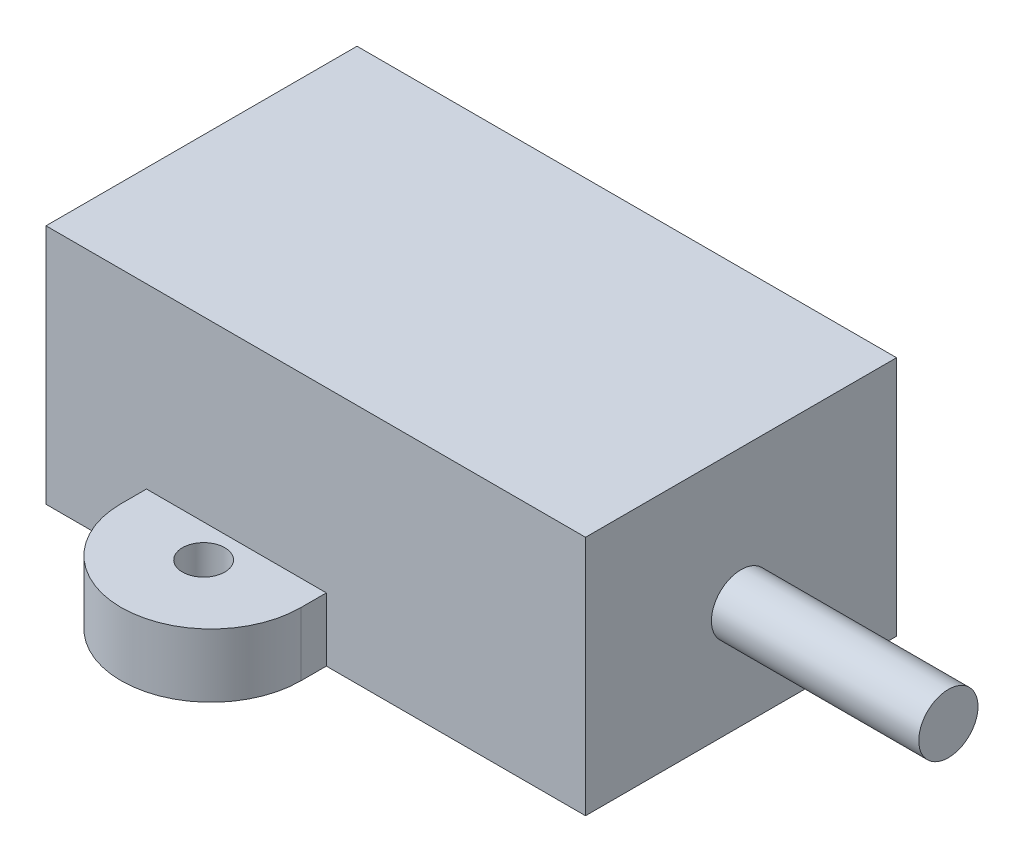
ISO-10303-21;
HEADER;
FILE_DESCRIPTION(('STEP AP214'),'2;1');
FILE_NAME('part.step','',(''),(''),'','','');
FILE_SCHEMA(('AUTOMOTIVE_DESIGN { 1 0 10303 214 1 1 1 1 }'));
ENDSEC;
DATA;
#1=APPLICATION_CONTEXT('core data for automotive mechanical design processes');
#2=APPLICATION_PROTOCOL_DEFINITION('international standard','automotive_design',2000,#1);
#3=PRODUCT_CONTEXT('',#1,'mechanical');
#4=PRODUCT('Part','Part','',(#3));
#5=PRODUCT_RELATED_PRODUCT_CATEGORY('part','',(#4));
#6=PRODUCT_DEFINITION_FORMATION('','',#4);
#7=PRODUCT_DEFINITION_CONTEXT('part definition',#1,'design');
#8=PRODUCT_DEFINITION('design','',#6,#7);
#9=PRODUCT_DEFINITION_SHAPE('','',#8);
#10=(LENGTH_UNIT() NAMED_UNIT(*) SI_UNIT(.MILLI.,.METRE.));
#11=(NAMED_UNIT(*) PLANE_ANGLE_UNIT() SI_UNIT($,.RADIAN.));
#12=(NAMED_UNIT(*) SI_UNIT($,.STERADIAN.) SOLID_ANGLE_UNIT());
#13=UNCERTAINTY_MEASURE_WITH_UNIT(LENGTH_MEASURE(1.E-05),#10,'distance_accuracy_value','');
#14=(GEOMETRIC_REPRESENTATION_CONTEXT(3) GLOBAL_UNCERTAINTY_ASSIGNED_CONTEXT((#13)) GLOBAL_UNIT_ASSIGNED_CONTEXT((#10,
#11,#12)) REPRESENTATION_CONTEXT('',''));
#15=CARTESIAN_POINT('',(0.,0.,0.));
#16=DIRECTION('',(0.,0.,1.));
#17=DIRECTION('',(1.,0.,0.));
#18=AXIS2_PLACEMENT_3D('',#15,#16,#17);
#19=CARTESIAN_POINT('',(-3.75,0.,8.55));
#20=DIRECTION('',(0.,-1.,0.));
#21=DIRECTION('',(0.,0.,-1.));
#22=AXIS2_PLACEMENT_3D('',#19,#20,#21);
#23=CYLINDRICAL_SURFACE('',#22,4.25);
#24=DIRECTION('',(0.,-1.,0.));
#25=VECTOR('',#24,1.);
#26=CARTESIAN_POINT('',(-8.,3.,8.55));
#27=LINE('',#26,#25);
#28=CARTESIAN_POINT('',(-8.,0.,8.55));
#29=VERTEX_POINT('',#28);
#30=CARTESIAN_POINT('',(-8.,3.,8.55));
#31=VERTEX_POINT('',#30);
#32=EDGE_CURVE('E137',#29,#31,#27,.F.);
#33=ORIENTED_EDGE('',*,*,#32,.F.);
#34=CARTESIAN_POINT('',(-3.75,0.,8.55));
#35=DIRECTION('',(0.,1.,0.));
#36=DIRECTION('',(0.,0.,1.));
#37=AXIS2_PLACEMENT_3D('',#34,#35,#36);
#38=CIRCLE('',#37,4.25);
#39=CARTESIAN_POINT('',(0.500000000000002,0.,8.55));
#40=VERTEX_POINT('',#39);
#41=EDGE_CURVE('E43',#40,#29,#38,.F.);
#42=ORIENTED_EDGE('',*,*,#41,.F.);
#43=DIRECTION('',(0.,-1.,0.));
#44=VECTOR('',#43,1.);
#45=CARTESIAN_POINT('',(0.500000000000002,3.,8.55));
#46=LINE('',#45,#44);
#47=CARTESIAN_POINT('',(0.500000000000002,3.,8.55));
#48=VERTEX_POINT('',#47);
#49=EDGE_CURVE('E224',#48,#40,#46,.T.);
#50=ORIENTED_EDGE('',*,*,#49,.F.);
#51=CARTESIAN_POINT('',(-3.75,3.,8.55));
#52=DIRECTION('',(0.,1.,0.));
#53=DIRECTION('',(0.,0.,1.));
#54=AXIS2_PLACEMENT_3D('',#51,#52,#53);
#55=CIRCLE('',#54,4.25);
#56=EDGE_CURVE('E11',#31,#48,#55,.T.);
#57=ORIENTED_EDGE('',*,*,#56,.F.);
#58=EDGE_LOOP('',(#33,#42,#50,#57));
#59=FACE_BOUND('',#58,.T.);
#60=ADVANCED_FACE('F35',(#59),#23,.T.);
#61=CARTESIAN_POINT('',(-12.75,11.4,7.35));
#62=DIRECTION('',(0.,0.,-1.));
#63=DIRECTION('',(-1.,0.,0.));
#64=AXIS2_PLACEMENT_3D('',#61,#62,#63);
#65=PLANE('',#64);
#66=DIRECTION('',(0.,-1.,0.));
#67=VECTOR('',#66,1.);
#68=CARTESIAN_POINT('',(-8.,3.,7.35));
#69=LINE('',#68,#67);
#70=CARTESIAN_POINT('',(-8.,3.,7.35));
#71=VERTEX_POINT('',#70);
#72=CARTESIAN_POINT('',(-8.,0.,7.35));
#73=VERTEX_POINT('',#72);
#74=EDGE_CURVE('E135',#71,#73,#69,.T.);
#75=ORIENTED_EDGE('',*,*,#74,.F.);
#76=DIRECTION('',(-1.,0.,0.));
#77=VECTOR('',#76,1.);
#78=CARTESIAN_POINT('',(-8.,3.,7.35));
#79=LINE('',#78,#77);
#80=CARTESIAN_POINT('',(0.500000000000002,3.,7.35));
#81=VERTEX_POINT('',#80);
#82=EDGE_CURVE('E119',#81,#71,#79,.T.);
#83=ORIENTED_EDGE('',*,*,#82,.F.);
#84=DIRECTION('',(0.,-1.,0.));
#85=VECTOR('',#84,1.);
#86=CARTESIAN_POINT('',(0.500000000000002,3.,7.35));
#87=LINE('',#86,#85);
#88=CARTESIAN_POINT('',(0.500000000000002,0.,7.35));
#89=VERTEX_POINT('',#88);
#90=EDGE_CURVE('E145',#81,#89,#87,.T.);
#91=ORIENTED_EDGE('',*,*,#90,.T.);
#92=DIRECTION('',(1.,0.,0.));
#93=VECTOR('',#92,1.);
#94=CARTESIAN_POINT('',(-12.75,0.,7.35));
#95=LINE('',#94,#93);
#96=CARTESIAN_POINT('',(12.75,0.,7.35));
#97=VERTEX_POINT('',#96);
#98=EDGE_CURVE('E198',#89,#97,#95,.T.);
#99=ORIENTED_EDGE('',*,*,#98,.T.);
#100=DIRECTION('',(0.,-1.,0.));
#101=VECTOR('',#100,1.);
#102=CARTESIAN_POINT('',(12.75,11.4,7.35));
#103=LINE('',#102,#101);
#104=CARTESIAN_POINT('',(12.75,11.4,7.35));
#105=VERTEX_POINT('',#104);
#106=EDGE_CURVE('E189',#105,#97,#103,.T.);
#107=ORIENTED_EDGE('',*,*,#106,.F.);
#108=DIRECTION('',(1.,0.,0.));
#109=VECTOR('',#108,1.);
#110=CARTESIAN_POINT('',(-12.75,11.4,7.35));
#111=LINE('',#110,#109);
#112=CARTESIAN_POINT('',(-12.75,11.4,7.35));
#113=VERTEX_POINT('',#112);
#114=EDGE_CURVE('E187',#113,#105,#111,.T.);
#115=ORIENTED_EDGE('',*,*,#114,.F.);
#116=DIRECTION('',(0.,-1.,0.));
#117=VECTOR('',#116,1.);
#118=CARTESIAN_POINT('',(-12.75,11.4,7.35));
#119=LINE('',#118,#117);
#120=CARTESIAN_POINT('',(-12.75,0.,7.35));
#121=VERTEX_POINT('',#120);
#122=EDGE_CURVE('E202',#113,#121,#119,.T.);
#123=ORIENTED_EDGE('',*,*,#122,.T.);
#124=EDGE_CURVE('E144',#121,#73,#95,.T.);
#125=ORIENTED_EDGE('',*,*,#124,.T.);
#126=EDGE_LOOP('',(#75,#83,#91,#99,#107,#115,#123,#125));
#127=FACE_BOUND('',#126,.T.);
#128=ADVANCED_FACE('F141',(#127),#65,.F.);
#129=CARTESIAN_POINT('',(-3.75,3.,-8.55));
#130=DIRECTION('',(0.,-1.,0.));
#131=DIRECTION('',(0.,0.,-1.));
#132=AXIS2_PLACEMENT_3D('',#129,#130,#131);
#133=CYLINDRICAL_SURFACE('',#132,4.25);
#134=DIRECTION('',(0.,-1.,0.));
#135=VECTOR('',#134,1.);
#136=CARTESIAN_POINT('',(-8.,3.,-8.55));
#137=LINE('',#136,#135);
#138=CARTESIAN_POINT('',(-8.,3.,-8.55));
#139=VERTEX_POINT('',#138);
#140=CARTESIAN_POINT('',(-8.,0.,-8.55));
#141=VERTEX_POINT('',#140);
#142=EDGE_CURVE('E213',#139,#141,#137,.T.);
#143=ORIENTED_EDGE('',*,*,#142,.F.);
#144=CARTESIAN_POINT('',(-3.75,3.,-8.55));
#145=DIRECTION('',(0.,1.,0.));
#146=DIRECTION('',(0.,0.,1.));
#147=AXIS2_PLACEMENT_3D('',#144,#145,#146);
#148=CIRCLE('',#147,4.25);
#149=CARTESIAN_POINT('',(0.500000000000002,3.,-8.55));
#150=VERTEX_POINT('',#149);
#151=EDGE_CURVE('E219',#150,#139,#148,.T.);
#152=ORIENTED_EDGE('',*,*,#151,.F.);
#153=DIRECTION('',(0.,-1.,0.));
#154=VECTOR('',#153,1.);
#155=CARTESIAN_POINT('',(0.500000000000002,3.,-8.55));
#156=LINE('',#155,#154);
#157=CARTESIAN_POINT('',(0.500000000000002,0.,-8.55));
#158=VERTEX_POINT('',#157);
#159=EDGE_CURVE('E216',#158,#150,#156,.F.);
#160=ORIENTED_EDGE('',*,*,#159,.F.);
#161=CARTESIAN_POINT('',(-3.75,0.,-8.55));
#162=DIRECTION('',(0.,1.,0.));
#163=DIRECTION('',(0.,0.,1.));
#164=AXIS2_PLACEMENT_3D('',#161,#162,#163);
#165=CIRCLE('',#164,4.25);
#166=EDGE_CURVE('E221',#141,#158,#165,.F.);
#167=ORIENTED_EDGE('',*,*,#166,.F.);
#168=EDGE_LOOP('',(#143,#152,#160,#167));
#169=FACE_BOUND('',#168,.T.);
#170=ADVANCED_FACE('F256',(#169),#133,.T.);
#171=CARTESIAN_POINT('',(-12.75,11.4,-7.35));
#172=DIRECTION('',(0.,0.,1.));
#173=DIRECTION('',(1.,0.,0.));
#174=AXIS2_PLACEMENT_3D('',#171,#172,#173);
#175=PLANE('',#174);
#176=DIRECTION('',(0.,-1.,0.));
#177=VECTOR('',#176,1.);
#178=CARTESIAN_POINT('',(0.500000000000002,3.,-7.35));
#179=LINE('',#178,#177);
#180=CARTESIAN_POINT('',(0.500000000000002,3.,-7.35));
#181=VERTEX_POINT('',#180);
#182=CARTESIAN_POINT('',(0.500000000000002,0.,-7.35));
#183=VERTEX_POINT('',#182);
#184=EDGE_CURVE('E167',#181,#183,#179,.T.);
#185=ORIENTED_EDGE('',*,*,#184,.F.);
#186=DIRECTION('',(-1.,0.,0.));
#187=VECTOR('',#186,1.);
#188=CARTESIAN_POINT('',(-8.,3.,-7.35));
#189=LINE('',#188,#187);
#190=CARTESIAN_POINT('',(-8.,3.,-7.35));
#191=VERTEX_POINT('',#190);
#192=EDGE_CURVE('E164',#181,#191,#189,.T.);
#193=ORIENTED_EDGE('',*,*,#192,.T.);
#194=DIRECTION('',(0.,-1.,0.));
#195=VECTOR('',#194,1.);
#196=CARTESIAN_POINT('',(-8.,3.,-7.35));
#197=LINE('',#196,#195);
#198=CARTESIAN_POINT('',(-8.,0.,-7.35));
#199=VERTEX_POINT('',#198);
#200=EDGE_CURVE('E171',#191,#199,#197,.T.);
#201=ORIENTED_EDGE('',*,*,#200,.T.);
#202=DIRECTION('',(-1.,0.,0.));
#203=VECTOR('',#202,1.);
#204=CARTESIAN_POINT('',(-12.75,0.,-7.35));
#205=LINE('',#204,#203);
#206=CARTESIAN_POINT('',(-12.75,0.,-7.35));
#207=VERTEX_POINT('',#206);
#208=EDGE_CURVE('E192',#199,#207,#205,.T.);
#209=ORIENTED_EDGE('',*,*,#208,.T.);
#210=DIRECTION('',(0.,-1.,0.));
#211=VECTOR('',#210,1.);
#212=CARTESIAN_POINT('',(-12.75,11.4,-7.35));
#213=LINE('',#212,#211);
#214=CARTESIAN_POINT('',(-12.75,11.4,-7.35));
#215=VERTEX_POINT('',#214);
#216=EDGE_CURVE('E204',#215,#207,#213,.T.);
#217=ORIENTED_EDGE('',*,*,#216,.F.);
#218=DIRECTION('',(-1.,0.,0.));
#219=VECTOR('',#218,1.);
#220=CARTESIAN_POINT('',(-12.75,11.4,-7.35));
#221=LINE('',#220,#219);
#222=CARTESIAN_POINT('',(12.75,11.4,-7.35));
#223=VERTEX_POINT('',#222);
#224=EDGE_CURVE('E183',#223,#215,#221,.T.);
#225=ORIENTED_EDGE('',*,*,#224,.F.);
#226=DIRECTION('',(0.,-1.,0.));
#227=VECTOR('',#226,1.);
#228=CARTESIAN_POINT('',(12.75,11.4,-7.35));
#229=LINE('',#228,#227);
#230=CARTESIAN_POINT('',(12.75,0.,-7.35));
#231=VERTEX_POINT('',#230);
#232=EDGE_CURVE('E207',#223,#231,#229,.T.);
#233=ORIENTED_EDGE('',*,*,#232,.T.);
#234=EDGE_CURVE('E193',#231,#183,#205,.T.);
#235=ORIENTED_EDGE('',*,*,#234,.T.);
#236=EDGE_LOOP('',(#185,#193,#201,#209,#217,#225,#233,#235));
#237=FACE_BOUND('',#236,.T.);
#238=ADVANCED_FACE('F261',(#237),#175,.F.);
#239=CARTESIAN_POINT('',(12.75,11.4,-7.35));
#240=DIRECTION('',(-1.,0.,0.));
#241=DIRECTION('',(0.,0.,1.));
#242=AXIS2_PLACEMENT_3D('',#239,#240,#241);
#243=PLANE('',#242);
#244=CARTESIAN_POINT('',(12.75,5.,0.));
#245=DIRECTION('',(-1.,0.,0.));
#246=DIRECTION('',(0.,0.,1.));
#247=AXIS2_PLACEMENT_3D('',#244,#245,#246);
#248=CIRCLE('',#247,1.4);
#249=CARTESIAN_POINT('',(12.75,5.,1.4));
#250=VERTEX_POINT('',#249);
#251=EDGE_CURVE('E210',#250,#250,#248,.F.);
#252=ORIENTED_EDGE('',*,*,#251,.F.);
#253=EDGE_LOOP('',(#252));
#254=FACE_BOUND('',#253,.T.);
#255=DIRECTION('',(0.,0.,-1.));
#256=VECTOR('',#255,1.);
#257=CARTESIAN_POINT('',(12.75,0.,-7.35));
#258=LINE('',#257,#256);
#259=EDGE_CURVE('E179',#97,#231,#258,.T.);
#260=ORIENTED_EDGE('',*,*,#259,.T.);
#261=ORIENTED_EDGE('',*,*,#232,.F.);
#262=DIRECTION('',(0.,0.,-1.));
#263=VECTOR('',#262,1.);
#264=CARTESIAN_POINT('',(12.75,11.4,-7.35));
#265=LINE('',#264,#263);
#266=EDGE_CURVE('E180',#105,#223,#265,.T.);
#267=ORIENTED_EDGE('',*,*,#266,.F.);
#268=ORIENTED_EDGE('',*,*,#106,.T.);
#269=EDGE_LOOP('',(#260,#261,#267,#268));
#270=FACE_BOUND('',#269,.T.);
#271=ADVANCED_FACE('F270',(#254,#270),#243,.F.);
#272=CARTESIAN_POINT('',(-12.75,11.4,-7.35));
#273=DIRECTION('',(1.,0.,0.));
#274=DIRECTION('',(0.,0.,-1.));
#275=AXIS2_PLACEMENT_3D('',#272,#273,#274);
#276=PLANE('',#275);
#277=DIRECTION('',(0.,0.,1.));
#278=VECTOR('',#277,1.);
#279=CARTESIAN_POINT('',(-12.75,0.,-7.35));
#280=LINE('',#279,#278);
#281=EDGE_CURVE('E196',#207,#121,#280,.T.);
#282=ORIENTED_EDGE('',*,*,#281,.T.);
#283=ORIENTED_EDGE('',*,*,#122,.F.);
#284=DIRECTION('',(0.,0.,1.));
#285=VECTOR('',#284,1.);
#286=CARTESIAN_POINT('',(-12.75,11.4,-7.35));
#287=LINE('',#286,#285);
#288=EDGE_CURVE('E185',#215,#113,#287,.T.);
#289=ORIENTED_EDGE('',*,*,#288,.F.);
#290=ORIENTED_EDGE('',*,*,#216,.T.);
#291=EDGE_LOOP('',(#282,#283,#289,#290));
#292=FACE_BOUND('',#291,.T.);
#293=ADVANCED_FACE('F266',(#292),#276,.F.);
#294=CARTESIAN_POINT('',(0.,11.4,0.));
#295=DIRECTION('',(0.,1.,0.));
#296=DIRECTION('',(0.,0.,1.));
#297=AXIS2_PLACEMENT_3D('',#294,#295,#296);
#298=PLANE('',#297);
#299=ORIENTED_EDGE('',*,*,#266,.T.);
#300=ORIENTED_EDGE('',*,*,#224,.T.);
#301=ORIENTED_EDGE('',*,*,#288,.T.);
#302=ORIENTED_EDGE('',*,*,#114,.T.);
#303=EDGE_LOOP('',(#299,#300,#301,#302));
#304=FACE_BOUND('',#303,.T.);
#305=ADVANCED_FACE('F269',(#304),#298,.T.);
#306=CARTESIAN_POINT('',(0.,0.,0.));
#307=DIRECTION('',(0.,1.,0.));
#308=DIRECTION('',(0.,0.,1.));
#309=AXIS2_PLACEMENT_3D('',#306,#307,#308);
#310=PLANE('',#309);
#311=DIRECTION('',(0.,0.,-1.));
#312=VECTOR('',#311,1.);
#313=CARTESIAN_POINT('',(0.500000000000001,0.,12.8));
#314=LINE('',#313,#312);
#315=EDGE_CURVE('E138',#40,#89,#314,.T.);
#316=ORIENTED_EDGE('',*,*,#315,.F.);
#317=ORIENTED_EDGE('',*,*,#41,.T.);
#318=DIRECTION('',(0.,0.,1.));
#319=VECTOR('',#318,1.);
#320=CARTESIAN_POINT('',(-8.,0.,12.8));
#321=LINE('',#320,#319);
#322=EDGE_CURVE('E229',#73,#29,#321,.T.);
#323=ORIENTED_EDGE('',*,*,#322,.F.);
#324=ORIENTED_EDGE('',*,*,#124,.F.);
#325=ORIENTED_EDGE('',*,*,#281,.F.);
#326=ORIENTED_EDGE('',*,*,#208,.F.);
#327=DIRECTION('',(0.,0.,-1.));
#328=VECTOR('',#327,1.);
#329=CARTESIAN_POINT('',(-8.,0.,-12.8));
#330=LINE('',#329,#328);
#331=EDGE_CURVE('E155',#199,#141,#330,.T.);
#332=ORIENTED_EDGE('',*,*,#331,.T.);
#333=ORIENTED_EDGE('',*,*,#166,.T.);
#334=DIRECTION('',(0.,0.,1.));
#335=VECTOR('',#334,1.);
#336=CARTESIAN_POINT('',(0.500000000000001,0.,-12.8));
#337=LINE('',#336,#335);
#338=EDGE_CURVE('E162',#158,#183,#337,.T.);
#339=ORIENTED_EDGE('',*,*,#338,.T.);
#340=ORIENTED_EDGE('',*,*,#234,.F.);
#341=ORIENTED_EDGE('',*,*,#259,.F.);
#342=ORIENTED_EDGE('',*,*,#98,.F.);
#343=EDGE_LOOP('',(#316,#317,#323,#324,#325,#326,#332,#333,#339,#340,#341,#342));
#344=FACE_BOUND('',#343,.T.);
#345=CARTESIAN_POINT('',(-3.75,0.,-8.9));
#346=DIRECTION('',(0.,-1.,0.));
#347=DIRECTION('',(0.,0.,-1.));
#348=AXIS2_PLACEMENT_3D('',#345,#346,#347);
#349=CIRCLE('',#348,1.);
#350=CARTESIAN_POINT('',(-3.75,0.,-9.9));
#351=VERTEX_POINT('',#350);
#352=EDGE_CURVE('E147',#351,#351,#349,.T.);
#353=ORIENTED_EDGE('',*,*,#352,.F.);
#354=EDGE_LOOP('',(#353));
#355=FACE_BOUND('',#354,.T.);
#356=CARTESIAN_POINT('',(-3.75,0.,8.9));
#357=DIRECTION('',(0.,1.,0.));
#358=DIRECTION('',(0.,0.,1.));
#359=AXIS2_PLACEMENT_3D('',#356,#357,#358);
#360=CIRCLE('',#359,1.);
#361=CARTESIAN_POINT('',(-3.75,0.,9.9));
#362=VERTEX_POINT('',#361);
#363=EDGE_CURVE('E234',#362,#362,#360,.T.);
#364=ORIENTED_EDGE('',*,*,#363,.T.);
#365=EDGE_LOOP('',(#364));
#366=FACE_BOUND('',#365,.T.);
#367=ADVANCED_FACE('F227',(#344,#355,#366),#310,.F.);
#368=CARTESIAN_POINT('',(22.55,5.,0.));
#369=DIRECTION('',(-1.,0.,0.));
#370=DIRECTION('',(0.,0.,1.));
#371=AXIS2_PLACEMENT_3D('',#368,#369,#370);
#372=CYLINDRICAL_SURFACE('',#371,1.4);
#373=CARTESIAN_POINT('',(22.55,5.,0.));
#374=DIRECTION('',(1.,0.,0.));
#375=DIRECTION('',(0.,0.,-1.));
#376=AXIS2_PLACEMENT_3D('',#373,#374,#375);
#377=CIRCLE('',#376,1.4);
#378=CARTESIAN_POINT('',(22.55,5.,-1.4));
#379=VERTEX_POINT('',#378);
#380=EDGE_CURVE('E174',#379,#379,#377,.T.);
#381=ORIENTED_EDGE('',*,*,#380,.F.);
#382=EDGE_LOOP('',(#381));
#383=FACE_BOUND('',#382,.T.);
#384=ORIENTED_EDGE('',*,*,#251,.T.);
#385=EDGE_LOOP('',(#384));
#386=FACE_BOUND('',#385,.T.);
#387=ADVANCED_FACE('F325',(#383,#386),#372,.T.);
#388=CARTESIAN_POINT('',(22.55,5.,0.));
#389=DIRECTION('',(1.,0.,0.));
#390=DIRECTION('',(0.,0.,-1.));
#391=AXIS2_PLACEMENT_3D('',#388,#389,#390);
#392=PLANE('',#391);
#393=ORIENTED_EDGE('',*,*,#380,.T.);
#394=EDGE_LOOP('',(#393));
#395=FACE_BOUND('',#394,.T.);
#396=ADVANCED_FACE('F319',(#395),#392,.T.);
#397=CARTESIAN_POINT('',(-8.,3.,-12.8));
#398=DIRECTION('',(-1.,0.,0.));
#399=DIRECTION('',(0.,0.,1.));
#400=AXIS2_PLACEMENT_3D('',#397,#398,#399);
#401=PLANE('',#400);
#402=DIRECTION('',(0.,0.,-1.));
#403=VECTOR('',#402,1.);
#404=CARTESIAN_POINT('',(-8.,3.,-12.8));
#405=LINE('',#404,#403);
#406=EDGE_CURVE('E158',#191,#139,#405,.T.);
#407=ORIENTED_EDGE('',*,*,#406,.T.);
#408=ORIENTED_EDGE('',*,*,#142,.T.);
#409=ORIENTED_EDGE('',*,*,#331,.F.);
#410=ORIENTED_EDGE('',*,*,#200,.F.);
#411=EDGE_LOOP('',(#407,#408,#409,#410));
#412=FACE_BOUND('',#411,.T.);
#413=ADVANCED_FACE('F302',(#412),#401,.T.);
#414=CARTESIAN_POINT('',(0.500000000000001,3.,-12.8));
#415=DIRECTION('',(1.,0.,0.));
#416=DIRECTION('',(0.,0.,-1.));
#417=AXIS2_PLACEMENT_3D('',#414,#415,#416);
#418=PLANE('',#417);
#419=ORIENTED_EDGE('',*,*,#338,.F.);
#420=ORIENTED_EDGE('',*,*,#159,.T.);
#421=DIRECTION('',(0.,0.,1.));
#422=VECTOR('',#421,1.);
#423=CARTESIAN_POINT('',(0.500000000000001,3.,-12.8));
#424=LINE('',#423,#422);
#425=EDGE_CURVE('E161',#150,#181,#424,.T.);
#426=ORIENTED_EDGE('',*,*,#425,.T.);
#427=ORIENTED_EDGE('',*,*,#184,.T.);
#428=EDGE_LOOP('',(#419,#420,#426,#427));
#429=FACE_BOUND('',#428,.T.);
#430=ADVANCED_FACE('F309',(#429),#418,.T.);
#431=CARTESIAN_POINT('',(0.,3.,0.));
#432=DIRECTION('',(0.,1.,0.));
#433=DIRECTION('',(0.,0.,1.));
#434=AXIS2_PLACEMENT_3D('',#431,#432,#433);
#435=PLANE('',#434);
#436=CARTESIAN_POINT('',(-3.75,3.,-8.9));
#437=DIRECTION('',(0.,-1.,0.));
#438=DIRECTION('',(0.,0.,-1.));
#439=AXIS2_PLACEMENT_3D('',#436,#437,#438);
#440=CIRCLE('',#439,1.);
#441=CARTESIAN_POINT('',(-3.75,3.,-9.9));
#442=VERTEX_POINT('',#441);
#443=EDGE_CURVE('E152',#442,#442,#440,.T.);
#444=ORIENTED_EDGE('',*,*,#443,.T.);
#445=EDGE_LOOP('',(#444));
#446=FACE_BOUND('',#445,.T.);
#447=ORIENTED_EDGE('',*,*,#425,.F.);
#448=ORIENTED_EDGE('',*,*,#151,.T.);
#449=ORIENTED_EDGE('',*,*,#406,.F.);
#450=ORIENTED_EDGE('',*,*,#192,.F.);
#451=EDGE_LOOP('',(#447,#448,#449,#450));
#452=FACE_BOUND('',#451,.T.);
#453=ADVANCED_FACE('F305',(#446,#452),#435,.T.);
#454=CARTESIAN_POINT('',(-3.75,3.,-8.9));
#455=DIRECTION('',(0.,-1.,0.));
#456=DIRECTION('',(0.,0.,-1.));
#457=AXIS2_PLACEMENT_3D('',#454,#455,#456);
#458=CYLINDRICAL_SURFACE('',#457,1.);
#459=ORIENTED_EDGE('',*,*,#443,.F.);
#460=EDGE_LOOP('',(#459));
#461=FACE_BOUND('',#460,.T.);
#462=ORIENTED_EDGE('',*,*,#352,.T.);
#463=EDGE_LOOP('',(#462));
#464=FACE_BOUND('',#463,.T.);
#465=ADVANCED_FACE('F316',(#461,#464),#458,.F.);
#466=CARTESIAN_POINT('',(0.,3.,0.));
#467=DIRECTION('',(0.,1.,0.));
#468=DIRECTION('',(0.,0.,-1.));
#469=AXIS2_PLACEMENT_3D('',#466,#467,#468);
#470=PLANE('',#469);
#471=DIRECTION('',(0.,0.,1.));
#472=VECTOR('',#471,1.);
#473=CARTESIAN_POINT('',(-8.,3.,12.8));
#474=LINE('',#473,#472);
#475=EDGE_CURVE('E123',#71,#31,#474,.T.);
#476=ORIENTED_EDGE('',*,*,#475,.T.);
#477=ORIENTED_EDGE('',*,*,#56,.T.);
#478=DIRECTION('',(0.,0.,-1.));
#479=VECTOR('',#478,1.);
#480=CARTESIAN_POINT('',(0.500000000000001,3.,12.8));
#481=LINE('',#480,#479);
#482=EDGE_CURVE('E125',#48,#81,#481,.T.);
#483=ORIENTED_EDGE('',*,*,#482,.T.);
#484=ORIENTED_EDGE('',*,*,#82,.T.);
#485=EDGE_LOOP('',(#476,#477,#483,#484));
#486=FACE_BOUND('',#485,.T.);
#487=CARTESIAN_POINT('',(-3.75,3.,8.9));
#488=DIRECTION('',(0.,1.,0.));
#489=DIRECTION('',(0.,0.,1.));
#490=AXIS2_PLACEMENT_3D('',#487,#488,#489);
#491=CIRCLE('',#490,1.);
#492=CARTESIAN_POINT('',(-3.75,3.,9.9));
#493=VERTEX_POINT('',#492);
#494=EDGE_CURVE('E231',#493,#493,#491,.T.);
#495=ORIENTED_EDGE('',*,*,#494,.F.);
#496=EDGE_LOOP('',(#495));
#497=FACE_BOUND('',#496,.T.);
#498=ADVANCED_FACE('F121',(#486,#497),#470,.T.);
#499=CARTESIAN_POINT('',(-8.,3.,12.8));
#500=DIRECTION('',(1.,0.,0.));
#501=DIRECTION('',(0.,0.,-1.));
#502=AXIS2_PLACEMENT_3D('',#499,#500,#501);
#503=PLANE('',#502);
#504=ORIENTED_EDGE('',*,*,#322,.T.);
#505=ORIENTED_EDGE('',*,*,#32,.T.);
#506=ORIENTED_EDGE('',*,*,#475,.F.);
#507=ORIENTED_EDGE('',*,*,#74,.T.);
#508=EDGE_LOOP('',(#504,#505,#506,#507));
#509=FACE_BOUND('',#508,.T.);
#510=ADVANCED_FACE('F134',(#509),#503,.F.);
#511=CARTESIAN_POINT('',(0.500000000000001,3.,12.8));
#512=DIRECTION('',(-1.,0.,0.));
#513=DIRECTION('',(0.,0.,1.));
#514=AXIS2_PLACEMENT_3D('',#511,#512,#513);
#515=PLANE('',#514);
#516=ORIENTED_EDGE('',*,*,#482,.F.);
#517=ORIENTED_EDGE('',*,*,#49,.T.);
#518=ORIENTED_EDGE('',*,*,#315,.T.);
#519=ORIENTED_EDGE('',*,*,#90,.F.);
#520=EDGE_LOOP('',(#516,#517,#518,#519));
#521=FACE_BOUND('',#520,.T.);
#522=ADVANCED_FACE('F243',(#521),#515,.F.);
#523=CARTESIAN_POINT('',(-3.75,3.,8.9));
#524=DIRECTION('',(0.,-1.,0.));
#525=DIRECTION('',(0.,0.,-1.));
#526=AXIS2_PLACEMENT_3D('',#523,#524,#525);
#527=CYLINDRICAL_SURFACE('',#526,1.);
#528=ORIENTED_EDGE('',*,*,#494,.T.);
#529=EDGE_LOOP('',(#528));
#530=FACE_BOUND('',#529,.T.);
#531=ORIENTED_EDGE('',*,*,#363,.F.);
#532=EDGE_LOOP('',(#531));
#533=FACE_BOUND('',#532,.T.);
#534=ADVANCED_FACE('F241',(#530,#533),#527,.F.);
#535=CLOSED_SHELL('',(#60,#128,#170,#238,#271,#293,#305,#367,#387,#396,#413,#430,#453,#465,#498,
#510,#522,#534));
#536=MANIFOLD_SOLID_BREP('B2',#535);
#537=ADVANCED_BREP_SHAPE_REPRESENTATION('',(#18,#536),#14);
#538=SHAPE_DEFINITION_REPRESENTATION(#9,#537);
ENDSEC;
END-ISO-10303-21;
